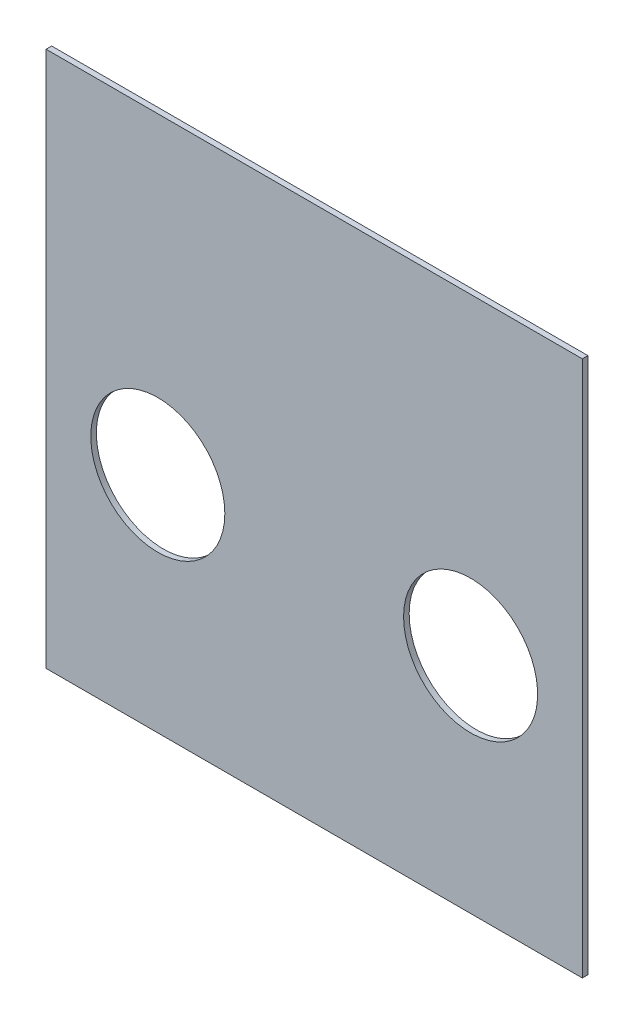
ISO-10303-21;
HEADER;
FILE_DESCRIPTION(('STEP AP214'),'2;1');
FILE_NAME('part.step','',(''),(''),'','','');
FILE_SCHEMA(('AUTOMOTIVE_DESIGN { 1 0 10303 214 1 1 1 1 }'));
ENDSEC;
DATA;
#1=APPLICATION_CONTEXT('core data for automotive mechanical design processes');
#2=APPLICATION_PROTOCOL_DEFINITION('international standard','automotive_design',2000,#1);
#3=PRODUCT_CONTEXT('',#1,'mechanical');
#4=PRODUCT('Part','Part','',(#3));
#5=PRODUCT_RELATED_PRODUCT_CATEGORY('part','',(#4));
#6=PRODUCT_DEFINITION_FORMATION('','',#4);
#7=PRODUCT_DEFINITION_CONTEXT('part definition',#1,'design');
#8=PRODUCT_DEFINITION('design','',#6,#7);
#9=PRODUCT_DEFINITION_SHAPE('','',#8);
#10=(LENGTH_UNIT() NAMED_UNIT(*) SI_UNIT(.MILLI.,.METRE.));
#11=(NAMED_UNIT(*) PLANE_ANGLE_UNIT() SI_UNIT($,.RADIAN.));
#12=(NAMED_UNIT(*) SI_UNIT($,.STERADIAN.) SOLID_ANGLE_UNIT());
#13=UNCERTAINTY_MEASURE_WITH_UNIT(LENGTH_MEASURE(1.E-05),#10,'distance_accuracy_value','');
#14=(GEOMETRIC_REPRESENTATION_CONTEXT(3) GLOBAL_UNCERTAINTY_ASSIGNED_CONTEXT((#13)) GLOBAL_UNIT_ASSIGNED_CONTEXT((#10,
#11,#12)) REPRESENTATION_CONTEXT('',''));
#15=CARTESIAN_POINT('',(0.,0.,0.));
#16=DIRECTION('',(0.,0.,1.));
#17=DIRECTION('',(1.,0.,0.));
#18=AXIS2_PLACEMENT_3D('',#15,#16,#17);
#19=CARTESIAN_POINT('',(304.8,-304.8,6.35));
#20=DIRECTION('',(-1.,0.,0.));
#21=DIRECTION('',(0.,0.,1.));
#22=AXIS2_PLACEMENT_3D('',#19,#20,#21);
#23=PLANE('',#22);
#24=DIRECTION('',(0.,1.,0.));
#25=VECTOR('',#24,1.);
#26=CARTESIAN_POINT('',(304.8,-304.8,0.));
#27=LINE('',#26,#25);
#28=CARTESIAN_POINT('',(304.8,-304.8,0.));
#29=VERTEX_POINT('',#28);
#30=CARTESIAN_POINT('',(304.8,304.8,0.));
#31=VERTEX_POINT('',#30);
#32=EDGE_CURVE('E106',#29,#31,#27,.T.);
#33=ORIENTED_EDGE('',*,*,#32,.T.);
#34=DIRECTION('',(0.,0.,-1.));
#35=VECTOR('',#34,1.);
#36=CARTESIAN_POINT('',(304.8,304.8,6.35));
#37=LINE('',#36,#35);
#38=CARTESIAN_POINT('',(304.8,304.8,6.35));
#39=VERTEX_POINT('',#38);
#40=EDGE_CURVE('E11',#39,#31,#37,.T.);
#41=ORIENTED_EDGE('',*,*,#40,.F.);
#42=DIRECTION('',(0.,1.,0.));
#43=VECTOR('',#42,1.);
#44=CARTESIAN_POINT('',(304.8,-304.8,6.35));
#45=LINE('',#44,#43);
#46=CARTESIAN_POINT('',(304.8,-304.8,6.35));
#47=VERTEX_POINT('',#46);
#48=EDGE_CURVE('E90',#47,#39,#45,.T.);
#49=ORIENTED_EDGE('',*,*,#48,.F.);
#50=DIRECTION('',(0.,0.,-1.));
#51=VECTOR('',#50,1.);
#52=CARTESIAN_POINT('',(304.8,-304.8,6.35));
#53=LINE('',#52,#51);
#54=EDGE_CURVE('E102',#47,#29,#53,.T.);
#55=ORIENTED_EDGE('',*,*,#54,.T.);
#56=EDGE_LOOP('',(#33,#41,#49,#55));
#57=FACE_BOUND('',#56,.T.);
#58=ADVANCED_FACE('F38',(#57),#23,.F.);
#59=CARTESIAN_POINT('',(-304.8,304.8,6.35));
#60=DIRECTION('',(0.,-1.,0.));
#61=DIRECTION('',(0.,0.,-1.));
#62=AXIS2_PLACEMENT_3D('',#59,#60,#61);
#63=PLANE('',#62);
#64=DIRECTION('',(-1.,0.,0.));
#65=VECTOR('',#64,1.);
#66=CARTESIAN_POINT('',(-304.8,304.8,0.));
#67=LINE('',#66,#65);
#68=CARTESIAN_POINT('',(-304.8,304.8,0.));
#69=VERTEX_POINT('',#68);
#70=EDGE_CURVE('E95',#31,#69,#67,.T.);
#71=ORIENTED_EDGE('',*,*,#70,.T.);
#72=DIRECTION('',(0.,0.,-1.));
#73=VECTOR('',#72,1.);
#74=CARTESIAN_POINT('',(-304.8,304.8,6.35));
#75=LINE('',#74,#73);
#76=CARTESIAN_POINT('',(-304.8,304.8,6.35));
#77=VERTEX_POINT('',#76);
#78=EDGE_CURVE('E47',#77,#69,#75,.T.);
#79=ORIENTED_EDGE('',*,*,#78,.F.);
#80=DIRECTION('',(-1.,0.,0.));
#81=VECTOR('',#80,1.);
#82=CARTESIAN_POINT('',(-304.8,304.8,6.35));
#83=LINE('',#82,#81);
#84=EDGE_CURVE('E85',#39,#77,#83,.T.);
#85=ORIENTED_EDGE('',*,*,#84,.F.);
#86=ORIENTED_EDGE('',*,*,#40,.T.);
#87=EDGE_LOOP('',(#71,#79,#85,#86));
#88=FACE_BOUND('',#87,.T.);
#89=ADVANCED_FACE('F94',(#88),#63,.F.);
#90=CARTESIAN_POINT('',(-304.8,-304.8,6.35));
#91=DIRECTION('',(1.,0.,0.));
#92=DIRECTION('',(0.,0.,-1.));
#93=AXIS2_PLACEMENT_3D('',#90,#91,#92);
#94=PLANE('',#93);
#95=DIRECTION('',(0.,-1.,0.));
#96=VECTOR('',#95,1.);
#97=CARTESIAN_POINT('',(-304.8,-304.8,0.));
#98=LINE('',#97,#96);
#99=CARTESIAN_POINT('',(-304.8,-304.8,0.));
#100=VERTEX_POINT('',#99);
#101=EDGE_CURVE('E72',#69,#100,#98,.T.);
#102=ORIENTED_EDGE('',*,*,#101,.T.);
#103=DIRECTION('',(0.,0.,-1.));
#104=VECTOR('',#103,1.);
#105=CARTESIAN_POINT('',(-304.8,-304.8,6.35));
#106=LINE('',#105,#104);
#107=CARTESIAN_POINT('',(-304.8,-304.8,6.35));
#108=VERTEX_POINT('',#107);
#109=EDGE_CURVE('E97',#108,#100,#106,.T.);
#110=ORIENTED_EDGE('',*,*,#109,.F.);
#111=DIRECTION('',(0.,-1.,0.));
#112=VECTOR('',#111,1.);
#113=CARTESIAN_POINT('',(-304.8,-304.8,6.35));
#114=LINE('',#113,#112);
#115=EDGE_CURVE('E88',#77,#108,#114,.T.);
#116=ORIENTED_EDGE('',*,*,#115,.F.);
#117=ORIENTED_EDGE('',*,*,#78,.T.);
#118=EDGE_LOOP('',(#102,#110,#116,#117));
#119=FACE_BOUND('',#118,.T.);
#120=ADVANCED_FACE('F98',(#119),#94,.F.);
#121=CARTESIAN_POINT('',(-304.8,-304.8,6.35));
#122=DIRECTION('',(0.,1.,0.));
#123=DIRECTION('',(0.,0.,1.));
#124=AXIS2_PLACEMENT_3D('',#121,#122,#123);
#125=PLANE('',#124);
#126=DIRECTION('',(1.,0.,0.));
#127=VECTOR('',#126,1.);
#128=CARTESIAN_POINT('',(-304.8,-304.8,0.));
#129=LINE('',#128,#127);
#130=EDGE_CURVE('E78',#100,#29,#129,.T.);
#131=ORIENTED_EDGE('',*,*,#130,.T.);
#132=ORIENTED_EDGE('',*,*,#54,.F.);
#133=DIRECTION('',(1.,0.,0.));
#134=VECTOR('',#133,1.);
#135=CARTESIAN_POINT('',(-304.8,-304.8,6.35));
#136=LINE('',#135,#134);
#137=EDGE_CURVE('E55',#108,#47,#136,.T.);
#138=ORIENTED_EDGE('',*,*,#137,.F.);
#139=ORIENTED_EDGE('',*,*,#109,.T.);
#140=EDGE_LOOP('',(#131,#132,#138,#139));
#141=FACE_BOUND('',#140,.T.);
#142=ADVANCED_FACE('F120',(#141),#125,.F.);
#143=CARTESIAN_POINT('',(0.,0.,6.35));
#144=DIRECTION('',(0.,0.,-1.));
#145=DIRECTION('',(-1.,0.,0.));
#146=AXIS2_PLACEMENT_3D('',#143,#144,#145);
#147=PLANE('',#146);
#148=CARTESIAN_POINT('',(-177.8,-50.8,6.35));
#149=DIRECTION('',(0.,0.,1.));
#150=DIRECTION('',(1.,0.,0.));
#151=AXIS2_PLACEMENT_3D('',#148,#149,#150);
#152=CIRCLE('',#151,76.2);
#153=CARTESIAN_POINT('',(-101.6,-50.8,6.35));
#154=VERTEX_POINT('',#153);
#155=EDGE_CURVE('E135',#154,#154,#152,.T.);
#156=ORIENTED_EDGE('',*,*,#155,.F.);
#157=EDGE_LOOP('',(#156));
#158=FACE_BOUND('',#157,.T.);
#159=CARTESIAN_POINT('',(177.8,-50.8,6.35));
#160=DIRECTION('',(0.,0.,1.));
#161=DIRECTION('',(-1.,0.,0.));
#162=AXIS2_PLACEMENT_3D('',#159,#160,#161);
#163=CIRCLE('',#162,76.2);
#164=CARTESIAN_POINT('',(101.6,-50.8,6.35));
#165=VERTEX_POINT('',#164);
#166=EDGE_CURVE('E127',#165,#165,#163,.T.);
#167=ORIENTED_EDGE('',*,*,#166,.F.);
#168=EDGE_LOOP('',(#167));
#169=FACE_BOUND('',#168,.T.);
#170=ORIENTED_EDGE('',*,*,#48,.T.);
#171=ORIENTED_EDGE('',*,*,#84,.T.);
#172=ORIENTED_EDGE('',*,*,#115,.T.);
#173=ORIENTED_EDGE('',*,*,#137,.T.);
#174=EDGE_LOOP('',(#170,#171,#172,#173));
#175=FACE_BOUND('',#174,.T.);
#176=ADVANCED_FACE('F86',(#158,#169,#175),#147,.F.);
#177=CARTESIAN_POINT('',(0.,0.,0.));
#178=DIRECTION('',(0.,0.,-1.));
#179=DIRECTION('',(-1.,0.,0.));
#180=AXIS2_PLACEMENT_3D('',#177,#178,#179);
#181=PLANE('',#180);
#182=CARTESIAN_POINT('',(-177.8,-50.8,0.));
#183=DIRECTION('',(0.,0.,1.));
#184=DIRECTION('',(1.,0.,0.));
#185=AXIS2_PLACEMENT_3D('',#182,#183,#184);
#186=CIRCLE('',#185,76.2);
#187=CARTESIAN_POINT('',(-101.6,-50.8,0.));
#188=VERTEX_POINT('',#187);
#189=EDGE_CURVE('E110',#188,#188,#186,.T.);
#190=ORIENTED_EDGE('',*,*,#189,.T.);
#191=EDGE_LOOP('',(#190));
#192=FACE_BOUND('',#191,.T.);
#193=CARTESIAN_POINT('',(177.8,-50.8,0.));
#194=DIRECTION('',(0.,0.,1.));
#195=DIRECTION('',(-1.,0.,0.));
#196=AXIS2_PLACEMENT_3D('',#193,#194,#195);
#197=CIRCLE('',#196,76.2);
#198=CARTESIAN_POINT('',(101.6,-50.8,0.));
#199=VERTEX_POINT('',#198);
#200=EDGE_CURVE('E131',#199,#199,#197,.T.);
#201=ORIENTED_EDGE('',*,*,#200,.T.);
#202=EDGE_LOOP('',(#201));
#203=FACE_BOUND('',#202,.T.);
#204=ORIENTED_EDGE('',*,*,#32,.F.);
#205=ORIENTED_EDGE('',*,*,#130,.F.);
#206=ORIENTED_EDGE('',*,*,#101,.F.);
#207=ORIENTED_EDGE('',*,*,#70,.F.);
#208=EDGE_LOOP('',(#204,#205,#206,#207));
#209=FACE_BOUND('',#208,.T.);
#210=ADVANCED_FACE('F123',(#192,#203,#209),#181,.T.);
#211=CARTESIAN_POINT('',(177.8,-50.8,0.));
#212=DIRECTION('',(0.,0.,1.));
#213=DIRECTION('',(1.,0.,0.));
#214=AXIS2_PLACEMENT_3D('',#211,#212,#213);
#215=CYLINDRICAL_SURFACE('',#214,76.2);
#216=ORIENTED_EDGE('',*,*,#200,.F.);
#217=EDGE_LOOP('',(#216));
#218=FACE_BOUND('',#217,.T.);
#219=ORIENTED_EDGE('',*,*,#166,.T.);
#220=EDGE_LOOP('',(#219));
#221=FACE_BOUND('',#220,.T.);
#222=ADVANCED_FACE('F148',(#218,#221),#215,.F.);
#223=CARTESIAN_POINT('',(-177.8,-50.8,0.));
#224=DIRECTION('',(0.,0.,1.));
#225=DIRECTION('',(1.,0.,0.));
#226=AXIS2_PLACEMENT_3D('',#223,#224,#225);
#227=CYLINDRICAL_SURFACE('',#226,76.2);
#228=ORIENTED_EDGE('',*,*,#189,.F.);
#229=EDGE_LOOP('',(#228));
#230=FACE_BOUND('',#229,.T.);
#231=ORIENTED_EDGE('',*,*,#155,.T.);
#232=EDGE_LOOP('',(#231));
#233=FACE_BOUND('',#232,.T.);
#234=ADVANCED_FACE('F145',(#230,#233),#227,.F.);
#235=CLOSED_SHELL('',(#58,#89,#120,#142,#176,#210,#222,#234));
#236=MANIFOLD_SOLID_BREP('B2',#235);
#237=ADVANCED_BREP_SHAPE_REPRESENTATION('',(#18,#236),#14);
#238=SHAPE_DEFINITION_REPRESENTATION(#9,#237);
ENDSEC;
END-ISO-10303-21;
